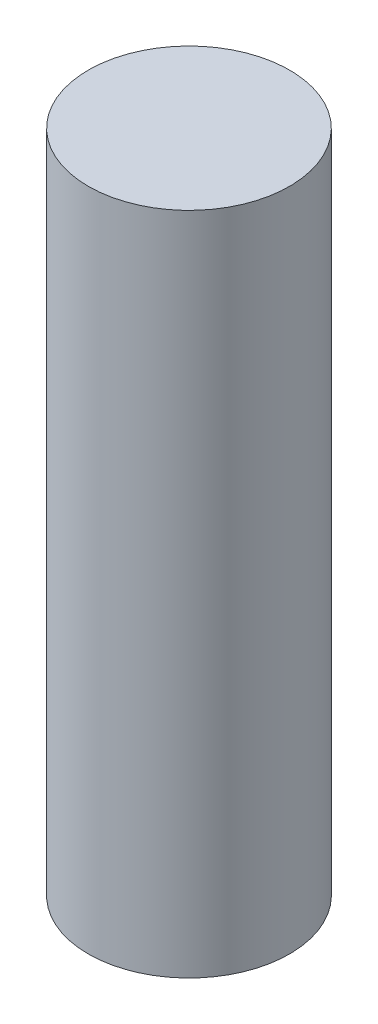
ISO-10303-21;
HEADER;
FILE_DESCRIPTION(('STEP AP214'),'2;1');
FILE_NAME('part.step','',(''),(''),'','','');
FILE_SCHEMA(('AUTOMOTIVE_DESIGN { 1 0 10303 214 1 1 1 1 }'));
ENDSEC;
DATA;
#1=APPLICATION_CONTEXT('core data for automotive mechanical design processes');
#2=APPLICATION_PROTOCOL_DEFINITION('international standard','automotive_design',2000,#1);
#3=PRODUCT_CONTEXT('',#1,'mechanical');
#4=PRODUCT('Part','Part','',(#3));
#5=PRODUCT_RELATED_PRODUCT_CATEGORY('part','',(#4));
#6=PRODUCT_DEFINITION_FORMATION('','',#4);
#7=PRODUCT_DEFINITION_CONTEXT('part definition',#1,'design');
#8=PRODUCT_DEFINITION('design','',#6,#7);
#9=PRODUCT_DEFINITION_SHAPE('','',#8);
#10=(LENGTH_UNIT() NAMED_UNIT(*) SI_UNIT(.MILLI.,.METRE.));
#11=(NAMED_UNIT(*) PLANE_ANGLE_UNIT() SI_UNIT($,.RADIAN.));
#12=(NAMED_UNIT(*) SI_UNIT($,.STERADIAN.) SOLID_ANGLE_UNIT());
#13=UNCERTAINTY_MEASURE_WITH_UNIT(LENGTH_MEASURE(1.E-05),#10,'distance_accuracy_value','');
#14=(GEOMETRIC_REPRESENTATION_CONTEXT(3) GLOBAL_UNCERTAINTY_ASSIGNED_CONTEXT((#13)) GLOBAL_UNIT_ASSIGNED_CONTEXT((#10,
#11,#12)) REPRESENTATION_CONTEXT('',''));
#15=CARTESIAN_POINT('',(0.,0.,0.));
#16=DIRECTION('',(0.,0.,1.));
#17=DIRECTION('',(1.,0.,0.));
#18=AXIS2_PLACEMENT_3D('',#15,#16,#17);
#19=CARTESIAN_POINT('',(0.,0.,0.));
#20=DIRECTION('',(0.,1.,0.));
#21=DIRECTION('',(0.,0.,1.));
#22=AXIS2_PLACEMENT_3D('',#19,#20,#21);
#23=PLANE('',#22);
#24=CARTESIAN_POINT('',(0.,0.,0.));
#25=DIRECTION('',(0.,1.,0.));
#26=DIRECTION('',(0.,0.,1.));
#27=AXIS2_PLACEMENT_3D('',#24,#25,#26);
#28=CIRCLE('',#27,7.5);
#29=CARTESIAN_POINT('',(0.,0.,7.5));
#30=VERTEX_POINT('',#29);
#31=EDGE_CURVE('E42',#30,#30,#28,.T.);
#32=ORIENTED_EDGE('',*,*,#31,.F.);
#33=EDGE_LOOP('',(#32));
#34=FACE_BOUND('',#33,.T.);
#35=ADVANCED_FACE('F36',(#34),#23,.F.);
#36=CARTESIAN_POINT('',(0.,49.526136737247,0.));
#37=DIRECTION('',(0.,1.,0.));
#38=DIRECTION('',(0.,0.,1.));
#39=AXIS2_PLACEMENT_3D('',#36,#37,#38);
#40=PLANE('',#39);
#41=CARTESIAN_POINT('',(0.,49.526136737247,0.));
#42=DIRECTION('',(0.,1.,0.));
#43=DIRECTION('',(0.,0.,1.));
#44=AXIS2_PLACEMENT_3D('',#41,#42,#43);
#45=CIRCLE('',#44,7.5);
#46=CARTESIAN_POINT('',(0.,49.526136737247,7.5));
#47=VERTEX_POINT('',#46);
#48=EDGE_CURVE('E10',#47,#47,#45,.T.);
#49=ORIENTED_EDGE('',*,*,#48,.T.);
#50=EDGE_LOOP('',(#49));
#51=FACE_BOUND('',#50,.T.);
#52=ADVANCED_FACE('F51',(#51),#40,.T.);
#53=CARTESIAN_POINT('',(0.,0.,0.));
#54=DIRECTION('',(0.,1.,0.));
#55=DIRECTION('',(0.,0.,1.));
#56=AXIS2_PLACEMENT_3D('',#53,#54,#55);
#57=CYLINDRICAL_SURFACE('',#56,7.5);
#58=ORIENTED_EDGE('',*,*,#48,.F.);
#59=EDGE_LOOP('',(#58));
#60=FACE_BOUND('',#59,.T.);
#61=ORIENTED_EDGE('',*,*,#31,.T.);
#62=EDGE_LOOP('',(#61));
#63=FACE_BOUND('',#62,.T.);
#64=ADVANCED_FACE('F48',(#60,#63),#57,.T.);
#65=CLOSED_SHELL('',(#35,#52,#64));
#66=MANIFOLD_SOLID_BREP('B2',#65);
#67=ADVANCED_BREP_SHAPE_REPRESENTATION('',(#18,#66),#14);
#68=SHAPE_DEFINITION_REPRESENTATION(#9,#67);
ENDSEC;
END-ISO-10303-21;
